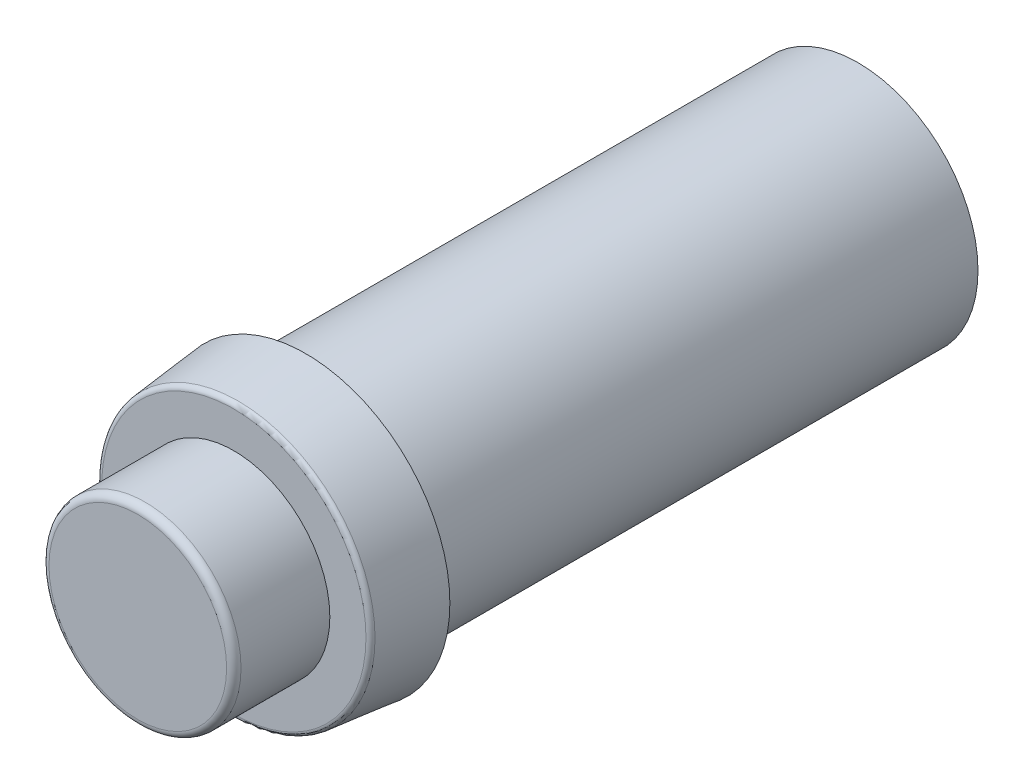
ISO-10303-21;
HEADER;
FILE_DESCRIPTION(('STEP AP214'),'2;1');
FILE_NAME('part.step','',(''),(''),'','','');
FILE_SCHEMA(('AUTOMOTIVE_DESIGN { 1 0 10303 214 1 1 1 1 }'));
ENDSEC;
DATA;
#1=APPLICATION_CONTEXT('core data for automotive mechanical design processes');
#2=APPLICATION_PROTOCOL_DEFINITION('international standard','automotive_design',2000,#1);
#3=PRODUCT_CONTEXT('',#1,'mechanical');
#4=PRODUCT('Part','Part','',(#3));
#5=PRODUCT_RELATED_PRODUCT_CATEGORY('part','',(#4));
#6=PRODUCT_DEFINITION_FORMATION('','',#4);
#7=PRODUCT_DEFINITION_CONTEXT('part definition',#1,'design');
#8=PRODUCT_DEFINITION('design','',#6,#7);
#9=PRODUCT_DEFINITION_SHAPE('','',#8);
#10=(LENGTH_UNIT() NAMED_UNIT(*) SI_UNIT(.MILLI.,.METRE.));
#11=(NAMED_UNIT(*) PLANE_ANGLE_UNIT() SI_UNIT($,.RADIAN.));
#12=(NAMED_UNIT(*) SI_UNIT($,.STERADIAN.) SOLID_ANGLE_UNIT());
#13=UNCERTAINTY_MEASURE_WITH_UNIT(LENGTH_MEASURE(1.E-05),#10,'distance_accuracy_value','');
#14=(GEOMETRIC_REPRESENTATION_CONTEXT(3) GLOBAL_UNCERTAINTY_ASSIGNED_CONTEXT((#13)) GLOBAL_UNIT_ASSIGNED_CONTEXT((#10,
#11,#12)) REPRESENTATION_CONTEXT('',''));
#15=CARTESIAN_POINT('',(0.,0.,0.));
#16=DIRECTION('',(0.,0.,1.));
#17=DIRECTION('',(1.,0.,0.));
#18=AXIS2_PLACEMENT_3D('',#15,#16,#17);
#19=CARTESIAN_POINT('',(0.,0.,7.));
#20=DIRECTION('',(0.,0.,-1.));
#21=DIRECTION('',(-1.,0.,0.));
#22=AXIS2_PLACEMENT_3D('',#19,#20,#21);
#23=CYLINDRICAL_SURFACE('',#22,4.);
#24=CARTESIAN_POINT('',(0.,0.,6.7));
#25=DIRECTION('',(0.,0.,1.));
#26=DIRECTION('',(1.,0.,0.));
#27=AXIS2_PLACEMENT_3D('',#24,#25,#26);
#28=CIRCLE('',#27,4.);
#29=CARTESIAN_POINT('',(4.,0.,6.7));
#30=VERTEX_POINT('',#29);
#31=EDGE_CURVE('E11',#30,#30,#28,.F.);
#32=ORIENTED_EDGE('',*,*,#31,.T.);
#33=EDGE_LOOP('',(#32));
#34=FACE_BOUND('',#33,.T.);
#35=CARTESIAN_POINT('',(0.,0.,3.));
#36=DIRECTION('',(0.,0.,1.));
#37=DIRECTION('',(1.,0.,0.));
#38=AXIS2_PLACEMENT_3D('',#35,#36,#37);
#39=CIRCLE('',#38,4.);
#40=CARTESIAN_POINT('',(4.,0.,3.));
#41=VERTEX_POINT('',#40);
#42=EDGE_CURVE('E51',#41,#41,#39,.T.);
#43=ORIENTED_EDGE('',*,*,#42,.T.);
#44=EDGE_LOOP('',(#43));
#45=FACE_BOUND('',#44,.T.);
#46=ADVANCED_FACE('F40',(#34,#45),#23,.T.);
#47=CARTESIAN_POINT('',(0.,0.,7.));
#48=DIRECTION('',(0.,0.,1.));
#49=DIRECTION('',(1.,0.,0.));
#50=AXIS2_PLACEMENT_3D('',#47,#48,#49);
#51=PLANE('',#50);
#52=CARTESIAN_POINT('',(0.,0.,7.));
#53=DIRECTION('',(0.,0.,1.));
#54=DIRECTION('',(1.,0.,0.));
#55=AXIS2_PLACEMENT_3D('',#52,#53,#54);
#56=CIRCLE('',#55,3.7);
#57=CARTESIAN_POINT('',(3.7,0.,7.));
#58=VERTEX_POINT('',#57);
#59=EDGE_CURVE('E47',#58,#58,#56,.T.);
#60=ORIENTED_EDGE('',*,*,#59,.T.);
#61=EDGE_LOOP('',(#60));
#62=FACE_BOUND('',#61,.T.);
#63=ADVANCED_FACE('F61',(#62),#51,.T.);
#64=CARTESIAN_POINT('',(0.,0.,3.));
#65=DIRECTION('',(0.,0.,1.));
#66=DIRECTION('',(1.,0.,0.));
#67=AXIS2_PLACEMENT_3D('',#64,#65,#66);
#68=PLANE('',#67);
#69=ORIENTED_EDGE('',*,*,#42,.F.);
#70=EDGE_LOOP('',(#69));
#71=FACE_BOUND('',#70,.T.);
#72=ADVANCED_FACE('F59',(#71),#68,.F.);
#73=CARTESIAN_POINT('',(0.,0.,6.7));
#74=DIRECTION('',(0.,0.,1.));
#75=DIRECTION('',(1.,0.,0.));
#76=AXIS2_PLACEMENT_3D('',#73,#74,#75);
#77=TOROIDAL_SURFACE('',#76,3.7,0.3);
#78=ORIENTED_EDGE('',*,*,#31,.F.);
#79=EDGE_LOOP('',(#78));
#80=FACE_BOUND('',#79,.T.);
#81=ORIENTED_EDGE('',*,*,#59,.F.);
#82=EDGE_LOOP('',(#81));
#83=FACE_BOUND('',#82,.T.);
#84=ADVANCED_FACE('F42',(#80,#83),#77,.T.);
#85=CLOSED_SHELL('',(#46,#63,#72,#84));
#86=MANIFOLD_SOLID_BREP('B2',#85);
#87=CARTESIAN_POINT('',(0.,0.,-23.));
#88=DIRECTION('',(0.,0.,1.));
#89=DIRECTION('',(1.,0.,0.));
#90=AXIS2_PLACEMENT_3D('',#87,#88,#89);
#91=CYLINDRICAL_SURFACE('',#90,5.);
#92=CARTESIAN_POINT('',(0.,0.,-23.));
#93=DIRECTION('',(0.,0.,1.));
#94=DIRECTION('',(1.,0.,0.));
#95=AXIS2_PLACEMENT_3D('',#92,#93,#94);
#96=CIRCLE('',#95,5.);
#97=CARTESIAN_POINT('',(5.,0.,-23.));
#98=VERTEX_POINT('',#97);
#99=EDGE_CURVE('E112',#98,#98,#96,.T.);
#100=ORIENTED_EDGE('',*,*,#99,.T.);
#101=EDGE_LOOP('',(#100));
#102=FACE_BOUND('',#101,.T.);
#103=CARTESIAN_POINT('',(0.,0.,0.));
#104=DIRECTION('',(0.,0.,1.));
#105=DIRECTION('',(1.,0.,0.));
#106=AXIS2_PLACEMENT_3D('',#103,#104,#105);
#107=CIRCLE('',#106,5.);
#108=CARTESIAN_POINT('',(5.,0.,0.));
#109=VERTEX_POINT('',#108);
#110=EDGE_CURVE('E116',#109,#109,#107,.T.);
#111=ORIENTED_EDGE('',*,*,#110,.F.);
#112=EDGE_LOOP('',(#111));
#113=FACE_BOUND('',#112,.T.);
#114=ADVANCED_FACE('F101',(#102,#113),#91,.T.);
#115=CARTESIAN_POINT('',(0.,0.,-23.));
#116=DIRECTION('',(0.,0.,1.));
#117=DIRECTION('',(1.,0.,0.));
#118=AXIS2_PLACEMENT_3D('',#115,#116,#117);
#119=PLANE('',#118);
#120=ORIENTED_EDGE('',*,*,#99,.F.);
#121=EDGE_LOOP('',(#120));
#122=FACE_BOUND('',#121,.T.);
#123=ADVANCED_FACE('F140',(#122),#119,.F.);
#124=CARTESIAN_POINT('',(0.,0.,0.));
#125=DIRECTION('',(0.,0.,-1.));
#126=DIRECTION('',(1.,0.,0.));
#127=AXIS2_PLACEMENT_3D('',#124,#125,#126);
#128=CONICAL_SURFACE('',#127,6.,0.10471975511966);
#129=CARTESIAN_POINT('',(0.,0.,2.82090569265353));
#130=DIRECTION('',(0.,0.,-1.));
#131=DIRECTION('',(-1.,0.,0.));
#132=AXIS2_PLACEMENT_3D('',#129,#130,#131);
#133=CIRCLE('',#132,5.70351086441706);
#134=CARTESIAN_POINT('',(-5.70351086441706,0.,2.82090569265353));
#135=VERTEX_POINT('',#134);
#136=EDGE_CURVE('E39',#135,#135,#133,.T.);
#137=ORIENTED_EDGE('',*,*,#136,.T.);
#138=EDGE_LOOP('',(#137));
#139=FACE_BOUND('',#138,.T.);
#140=CARTESIAN_POINT('',(0.,0.,0.));
#141=DIRECTION('',(0.,0.,1.));
#142=DIRECTION('',(1.,0.,0.));
#143=AXIS2_PLACEMENT_3D('',#140,#141,#142);
#144=CIRCLE('',#143,6.);
#145=CARTESIAN_POINT('',(6.,0.,0.));
#146=VERTEX_POINT('',#145);
#147=EDGE_CURVE('E120',#146,#146,#144,.T.);
#148=ORIENTED_EDGE('',*,*,#147,.T.);
#149=EDGE_LOOP('',(#148));
#150=FACE_BOUND('',#149,.T.);
#151=ADVANCED_FACE('F125',(#139,#150),#128,.T.);
#152=CARTESIAN_POINT('',(0.,0.,3.));
#153=DIRECTION('',(0.,0.,1.));
#154=DIRECTION('',(1.,0.,0.));
#155=AXIS2_PLACEMENT_3D('',#152,#153,#154);
#156=PLANE('',#155);
#157=CARTESIAN_POINT('',(0.,0.,3.));
#158=DIRECTION('',(0.,0.,1.));
#159=DIRECTION('',(1.,0.,0.));
#160=AXIS2_PLACEMENT_3D('',#157,#158,#159);
#161=CIRCLE('',#160,5.5046064853434);
#162=CARTESIAN_POINT('',(5.5046064853434,0.,3.));
#163=VERTEX_POINT('',#162);
#164=EDGE_CURVE('E108',#163,#163,#161,.T.);
#165=ORIENTED_EDGE('',*,*,#164,.T.);
#166=EDGE_LOOP('',(#165));
#167=FACE_BOUND('',#166,.T.);
#168=ADVANCED_FACE('F129',(#167),#156,.T.);
#169=CARTESIAN_POINT('',(0.,0.,0.));
#170=DIRECTION('',(0.,0.,1.));
#171=DIRECTION('',(1.,0.,0.));
#172=AXIS2_PLACEMENT_3D('',#169,#170,#171);
#173=PLANE('',#172);
#174=ORIENTED_EDGE('',*,*,#110,.T.);
#175=EDGE_LOOP('',(#174));
#176=FACE_BOUND('',#175,.T.);
#177=ORIENTED_EDGE('',*,*,#147,.F.);
#178=EDGE_LOOP('',(#177));
#179=FACE_BOUND('',#178,.T.);
#180=ADVANCED_FACE('F127',(#176,#179),#173,.F.);
#181=CARTESIAN_POINT('',(0.,0.,2.8));
#182=DIRECTION('',(0.,0.,1.));
#183=DIRECTION('',(1.,0.,0.));
#184=AXIS2_PLACEMENT_3D('',#181,#182,#183);
#185=TOROIDAL_SURFACE('',#184,5.5046064853434,0.2);
#186=ORIENTED_EDGE('',*,*,#136,.F.);
#187=EDGE_LOOP('',(#186));
#188=FACE_BOUND('',#187,.T.);
#189=ORIENTED_EDGE('',*,*,#164,.F.);
#190=EDGE_LOOP('',(#189));
#191=FACE_BOUND('',#190,.T.);
#192=ADVANCED_FACE('F103',(#188,#191),#185,.T.);
#193=CLOSED_SHELL('',(#114,#123,#151,#168,#180,#192));
#194=MANIFOLD_SOLID_BREP('B6',#193);
#195=ADVANCED_BREP_SHAPE_REPRESENTATION('',(#18,#86,#194),#14);
#196=SHAPE_DEFINITION_REPRESENTATION(#9,#195);
ENDSEC;
END-ISO-10303-21;
